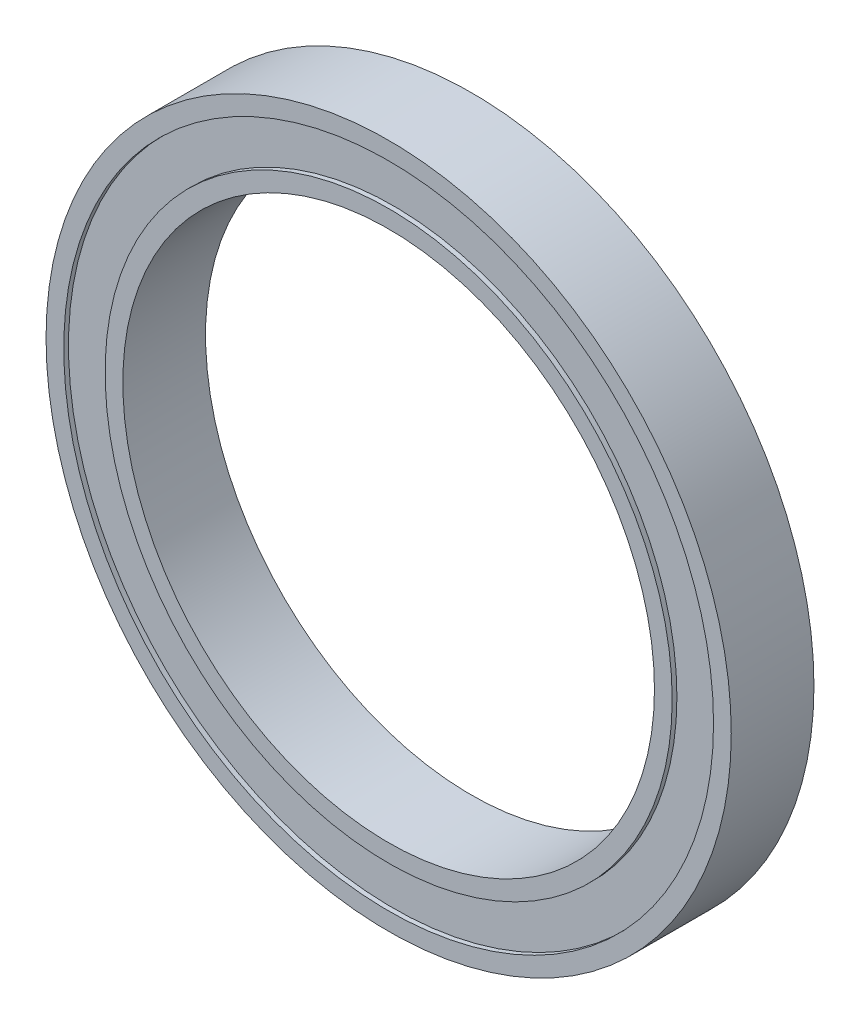
ISO-10303-21;
HEADER;
FILE_DESCRIPTION(('STEP AP214'),'2;1');
FILE_NAME('part.step','',(''),(''),'','','');
FILE_SCHEMA(('AUTOMOTIVE_DESIGN { 1 0 10303 214 1 1 1 1 }'));
ENDSEC;
DATA;
#1=APPLICATION_CONTEXT('core data for automotive mechanical design processes');
#2=APPLICATION_PROTOCOL_DEFINITION('international standard','automotive_design',2000,#1);
#3=PRODUCT_CONTEXT('',#1,'mechanical');
#4=PRODUCT('Part','Part','',(#3));
#5=PRODUCT_RELATED_PRODUCT_CATEGORY('part','',(#4));
#6=PRODUCT_DEFINITION_FORMATION('','',#4);
#7=PRODUCT_DEFINITION_CONTEXT('part definition',#1,'design');
#8=PRODUCT_DEFINITION('design','',#6,#7);
#9=PRODUCT_DEFINITION_SHAPE('','',#8);
#10=(LENGTH_UNIT() NAMED_UNIT(*) SI_UNIT(.MILLI.,.METRE.));
#11=(NAMED_UNIT(*) PLANE_ANGLE_UNIT() SI_UNIT($,.RADIAN.));
#12=(NAMED_UNIT(*) SI_UNIT($,.STERADIAN.) SOLID_ANGLE_UNIT());
#13=UNCERTAINTY_MEASURE_WITH_UNIT(LENGTH_MEASURE(1.E-05),#10,'distance_accuracy_value','');
#14=(GEOMETRIC_REPRESENTATION_CONTEXT(3) GLOBAL_UNCERTAINTY_ASSIGNED_CONTEXT((#13)) GLOBAL_UNIT_ASSIGNED_CONTEXT((#10,
#11,#12)) REPRESENTATION_CONTEXT('',''));
#15=CARTESIAN_POINT('',(0.,0.,0.));
#16=DIRECTION('',(0.,0.,1.));
#17=DIRECTION('',(1.,0.,0.));
#18=AXIS2_PLACEMENT_3D('',#15,#16,#17);
#19=CARTESIAN_POINT('',(0.,0.,0.));
#20=DIRECTION('',(0.,0.,1.));
#21=DIRECTION('',(1.,0.,0.));
#22=AXIS2_PLACEMENT_3D('',#19,#20,#21);
#23=PLANE('',#22);
#24=CARTESIAN_POINT('',(0.,0.,0.));
#25=DIRECTION('',(0.,0.,1.));
#26=DIRECTION('',(1.,0.,0.));
#27=AXIS2_PLACEMENT_3D('',#24,#25,#26);
#28=CIRCLE('',#27,22.5);
#29=CARTESIAN_POINT('',(22.5,0.,0.));
#30=VERTEX_POINT('',#29);
#31=EDGE_CURVE('E45',#30,#30,#28,.T.);
#32=ORIENTED_EDGE('',*,*,#31,.T.);
#33=EDGE_LOOP('',(#32));
#34=FACE_BOUND('',#33,.T.);
#35=CARTESIAN_POINT('',(0.,0.,0.));
#36=DIRECTION('',(0.,0.,-1.));
#37=DIRECTION('',(-1.,0.,0.));
#38=AXIS2_PLACEMENT_3D('',#35,#36,#37);
#39=CIRCLE('',#38,24.);
#40=CARTESIAN_POINT('',(-24.,0.,0.));
#41=VERTEX_POINT('',#40);
#42=EDGE_CURVE('E69',#41,#41,#39,.T.);
#43=ORIENTED_EDGE('',*,*,#42,.T.);
#44=EDGE_LOOP('',(#43));
#45=FACE_BOUND('',#44,.T.);
#46=ADVANCED_FACE('F32',(#34,#45),#23,.F.);
#47=CARTESIAN_POINT('',(0.,0.,7.));
#48=DIRECTION('',(0.,0.,1.));
#49=DIRECTION('',(1.,0.,0.));
#50=AXIS2_PLACEMENT_3D('',#47,#48,#49);
#51=PLANE('',#50);
#52=CARTESIAN_POINT('',(0.,0.,7.));
#53=DIRECTION('',(0.,0.,1.));
#54=DIRECTION('',(1.,0.,0.));
#55=AXIS2_PLACEMENT_3D('',#52,#53,#54);
#56=CIRCLE('',#55,22.5);
#57=CARTESIAN_POINT('',(22.5,0.,7.));
#58=VERTEX_POINT('',#57);
#59=EDGE_CURVE('E43',#58,#58,#56,.T.);
#60=ORIENTED_EDGE('',*,*,#59,.F.);
#61=EDGE_LOOP('',(#60));
#62=FACE_BOUND('',#61,.T.);
#63=CARTESIAN_POINT('',(0.,0.,7.));
#64=DIRECTION('',(0.,0.,1.));
#65=DIRECTION('',(1.,0.,0.));
#66=AXIS2_PLACEMENT_3D('',#63,#64,#65);
#67=CIRCLE('',#66,24.);
#68=CARTESIAN_POINT('',(24.,0.,7.));
#69=VERTEX_POINT('',#68);
#70=EDGE_CURVE('E57',#69,#69,#67,.T.);
#71=ORIENTED_EDGE('',*,*,#70,.T.);
#72=EDGE_LOOP('',(#71));
#73=FACE_BOUND('',#72,.T.);
#74=ADVANCED_FACE('F107',(#62,#73),#51,.T.);
#75=CARTESIAN_POINT('',(0.,0.,7.));
#76=DIRECTION('',(0.,0.,1.));
#77=DIRECTION('',(1.,0.,0.));
#78=AXIS2_PLACEMENT_3D('',#75,#76,#77);
#79=CIRCLE('',#78,27.5);
#80=CARTESIAN_POINT('',(27.5,0.,7.));
#81=VERTEX_POINT('',#80);
#82=EDGE_CURVE('E51',#81,#81,#79,.T.);
#83=ORIENTED_EDGE('',*,*,#82,.F.);
#84=EDGE_LOOP('',(#83));
#85=FACE_BOUND('',#84,.T.);
#86=CARTESIAN_POINT('',(0.,0.,7.));
#87=DIRECTION('',(0.,0.,1.));
#88=DIRECTION('',(1.,0.,0.));
#89=AXIS2_PLACEMENT_3D('',#86,#87,#88);
#90=CIRCLE('',#89,29.);
#91=CARTESIAN_POINT('',(29.,0.,7.));
#92=VERTEX_POINT('',#91);
#93=EDGE_CURVE('E10',#92,#92,#90,.T.);
#94=ORIENTED_EDGE('',*,*,#93,.T.);
#95=EDGE_LOOP('',(#94));
#96=FACE_BOUND('',#95,.T.);
#97=ADVANCED_FACE('F94',(#85,#96),#51,.T.);
#98=CARTESIAN_POINT('',(0.,0.,0.));
#99=DIRECTION('',(0.,0.,-1.));
#100=DIRECTION('',(-1.,0.,0.));
#101=AXIS2_PLACEMENT_3D('',#98,#99,#100);
#102=CIRCLE('',#101,27.5);
#103=CARTESIAN_POINT('',(-27.5,0.,0.));
#104=VERTEX_POINT('',#103);
#105=EDGE_CURVE('E63',#104,#104,#102,.T.);
#106=ORIENTED_EDGE('',*,*,#105,.F.);
#107=EDGE_LOOP('',(#106));
#108=FACE_BOUND('',#107,.T.);
#109=CARTESIAN_POINT('',(0.,0.,0.));
#110=DIRECTION('',(0.,0.,1.));
#111=DIRECTION('',(1.,0.,0.));
#112=AXIS2_PLACEMENT_3D('',#109,#110,#111);
#113=CIRCLE('',#112,29.);
#114=CARTESIAN_POINT('',(29.,0.,0.));
#115=VERTEX_POINT('',#114);
#116=EDGE_CURVE('E36',#115,#115,#113,.T.);
#117=ORIENTED_EDGE('',*,*,#116,.F.);
#118=EDGE_LOOP('',(#117));
#119=FACE_BOUND('',#118,.T.);
#120=ADVANCED_FACE('F91',(#108,#119),#23,.F.);
#121=CARTESIAN_POINT('',(0.,0.,7.));
#122=DIRECTION('',(0.,0.,-1.));
#123=DIRECTION('',(-1.,0.,0.));
#124=AXIS2_PLACEMENT_3D('',#121,#122,#123);
#125=CYLINDRICAL_SURFACE('',#124,29.);
#126=ORIENTED_EDGE('',*,*,#93,.F.);
#127=EDGE_LOOP('',(#126));
#128=FACE_BOUND('',#127,.T.);
#129=ORIENTED_EDGE('',*,*,#116,.T.);
#130=EDGE_LOOP('',(#129));
#131=FACE_BOUND('',#130,.T.);
#132=ADVANCED_FACE('F34',(#128,#131),#125,.T.);
#133=CARTESIAN_POINT('',(0.,0.,7.));
#134=DIRECTION('',(0.,0.,-1.));
#135=DIRECTION('',(-1.,0.,0.));
#136=AXIS2_PLACEMENT_3D('',#133,#134,#135);
#137=CYLINDRICAL_SURFACE('',#136,22.5);
#138=ORIENTED_EDGE('',*,*,#59,.T.);
#139=EDGE_LOOP('',(#138));
#140=FACE_BOUND('',#139,.T.);
#141=ORIENTED_EDGE('',*,*,#31,.F.);
#142=EDGE_LOOP('',(#141));
#143=FACE_BOUND('',#142,.T.);
#144=ADVANCED_FACE('F98',(#140,#143),#137,.F.);
#145=CARTESIAN_POINT('',(0.,0.,6.6));
#146=DIRECTION('',(0.,0.,1.));
#147=DIRECTION('',(1.,0.,0.));
#148=AXIS2_PLACEMENT_3D('',#145,#146,#147);
#149=CYLINDRICAL_SURFACE('',#148,27.5);
#150=CARTESIAN_POINT('',(0.,0.,6.6));
#151=DIRECTION('',(0.,0.,1.));
#152=DIRECTION('',(1.,0.,0.));
#153=AXIS2_PLACEMENT_3D('',#150,#151,#152);
#154=CIRCLE('',#153,27.5);
#155=CARTESIAN_POINT('',(27.5,0.,6.6));
#156=VERTEX_POINT('',#155);
#157=EDGE_CURVE('E48',#156,#156,#154,.T.);
#158=ORIENTED_EDGE('',*,*,#157,.F.);
#159=EDGE_LOOP('',(#158));
#160=FACE_BOUND('',#159,.T.);
#161=ORIENTED_EDGE('',*,*,#82,.T.);
#162=EDGE_LOOP('',(#161));
#163=FACE_BOUND('',#162,.T.);
#164=ADVANCED_FACE('F103',(#160,#163),#149,.F.);
#165=CARTESIAN_POINT('',(0.,0.,6.6));
#166=DIRECTION('',(0.,0.,1.));
#167=DIRECTION('',(1.,0.,0.));
#168=AXIS2_PLACEMENT_3D('',#165,#166,#167);
#169=PLANE('',#168);
#170=CARTESIAN_POINT('',(0.,0.,6.6));
#171=DIRECTION('',(0.,0.,1.));
#172=DIRECTION('',(1.,0.,0.));
#173=AXIS2_PLACEMENT_3D('',#170,#171,#172);
#174=CIRCLE('',#173,24.);
#175=CARTESIAN_POINT('',(24.,0.,6.6));
#176=VERTEX_POINT('',#175);
#177=EDGE_CURVE('E54',#176,#176,#174,.T.);
#178=ORIENTED_EDGE('',*,*,#177,.F.);
#179=EDGE_LOOP('',(#178));
#180=FACE_BOUND('',#179,.T.);
#181=ORIENTED_EDGE('',*,*,#157,.T.);
#182=EDGE_LOOP('',(#181));
#183=FACE_BOUND('',#182,.T.);
#184=ADVANCED_FACE('F120',(#180,#183),#169,.T.);
#185=CARTESIAN_POINT('',(0.,0.,6.6));
#186=DIRECTION('',(0.,0.,1.));
#187=DIRECTION('',(1.,0.,0.));
#188=AXIS2_PLACEMENT_3D('',#185,#186,#187);
#189=CYLINDRICAL_SURFACE('',#188,24.);
#190=ORIENTED_EDGE('',*,*,#177,.T.);
#191=EDGE_LOOP('',(#190));
#192=FACE_BOUND('',#191,.T.);
#193=ORIENTED_EDGE('',*,*,#70,.F.);
#194=EDGE_LOOP('',(#193));
#195=FACE_BOUND('',#194,.T.);
#196=ADVANCED_FACE('F87',(#192,#195),#189,.T.);
#197=CARTESIAN_POINT('',(0.,0.,0.4));
#198=DIRECTION('',(0.,0.,-1.));
#199=DIRECTION('',(-1.,0.,0.));
#200=AXIS2_PLACEMENT_3D('',#197,#198,#199);
#201=CYLINDRICAL_SURFACE('',#200,27.5);
#202=CARTESIAN_POINT('',(0.,0.,0.4));
#203=DIRECTION('',(0.,0.,-1.));
#204=DIRECTION('',(-1.,0.,0.));
#205=AXIS2_PLACEMENT_3D('',#202,#203,#204);
#206=CIRCLE('',#205,27.5);
#207=CARTESIAN_POINT('',(-27.5,0.,0.4));
#208=VERTEX_POINT('',#207);
#209=EDGE_CURVE('E60',#208,#208,#206,.T.);
#210=ORIENTED_EDGE('',*,*,#209,.F.);
#211=EDGE_LOOP('',(#210));
#212=FACE_BOUND('',#211,.T.);
#213=ORIENTED_EDGE('',*,*,#105,.T.);
#214=EDGE_LOOP('',(#213));
#215=FACE_BOUND('',#214,.T.);
#216=ADVANCED_FACE('F81',(#212,#215),#201,.F.);
#217=CARTESIAN_POINT('',(0.,0.,0.4));
#218=DIRECTION('',(0.,0.,-1.));
#219=DIRECTION('',(-1.,0.,0.));
#220=AXIS2_PLACEMENT_3D('',#217,#218,#219);
#221=PLANE('',#220);
#222=CARTESIAN_POINT('',(0.,0.,0.4));
#223=DIRECTION('',(0.,0.,-1.));
#224=DIRECTION('',(-1.,0.,0.));
#225=AXIS2_PLACEMENT_3D('',#222,#223,#224);
#226=CIRCLE('',#225,24.);
#227=CARTESIAN_POINT('',(-24.,0.,0.4));
#228=VERTEX_POINT('',#227);
#229=EDGE_CURVE('E66',#228,#228,#226,.T.);
#230=ORIENTED_EDGE('',*,*,#229,.F.);
#231=EDGE_LOOP('',(#230));
#232=FACE_BOUND('',#231,.T.);
#233=ORIENTED_EDGE('',*,*,#209,.T.);
#234=EDGE_LOOP('',(#233));
#235=FACE_BOUND('',#234,.T.);
#236=ADVANCED_FACE('F78',(#232,#235),#221,.T.);
#237=CARTESIAN_POINT('',(0.,0.,0.4));
#238=DIRECTION('',(0.,0.,-1.));
#239=DIRECTION('',(-1.,0.,0.));
#240=AXIS2_PLACEMENT_3D('',#237,#238,#239);
#241=CYLINDRICAL_SURFACE('',#240,24.);
#242=ORIENTED_EDGE('',*,*,#229,.T.);
#243=EDGE_LOOP('',(#242));
#244=FACE_BOUND('',#243,.T.);
#245=ORIENTED_EDGE('',*,*,#42,.F.);
#246=EDGE_LOOP('',(#245));
#247=FACE_BOUND('',#246,.T.);
#248=ADVANCED_FACE('F75',(#244,#247),#241,.T.);
#249=CLOSED_SHELL('',(#46,#74,#97,#120,#132,#144,#164,#184,#196,#216,#236,#248));
#250=MANIFOLD_SOLID_BREP('B2',#249);
#251=ADVANCED_BREP_SHAPE_REPRESENTATION('',(#18,#250),#14);
#252=SHAPE_DEFINITION_REPRESENTATION(#9,#251);
ENDSEC;
END-ISO-10303-21;
